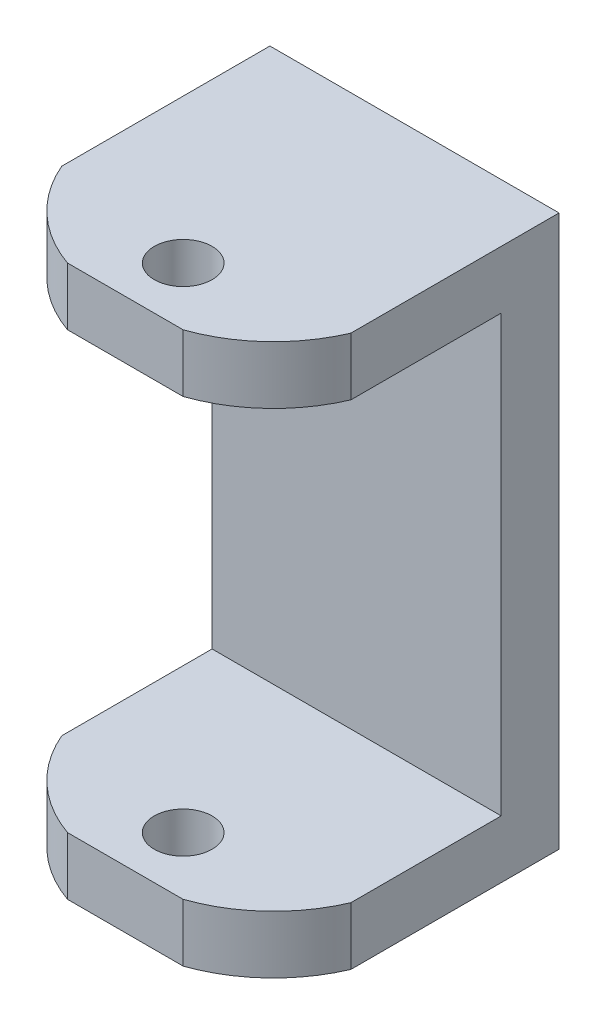
ISO-10303-21;
HEADER;
FILE_DESCRIPTION(('STEP AP214'),'2;1');
FILE_NAME('part.step','',(''),(''),'','','');
FILE_SCHEMA(('AUTOMOTIVE_DESIGN { 1 0 10303 214 1 1 1 1 }'));
ENDSEC;
DATA;
#1=APPLICATION_CONTEXT('core data for automotive mechanical design processes');
#2=APPLICATION_PROTOCOL_DEFINITION('international standard','automotive_design',2000,#1);
#3=PRODUCT_CONTEXT('',#1,'mechanical');
#4=PRODUCT('Part','Part','',(#3));
#5=PRODUCT_RELATED_PRODUCT_CATEGORY('part','',(#4));
#6=PRODUCT_DEFINITION_FORMATION('','',#4);
#7=PRODUCT_DEFINITION_CONTEXT('part definition',#1,'design');
#8=PRODUCT_DEFINITION('design','',#6,#7);
#9=PRODUCT_DEFINITION_SHAPE('','',#8);
#10=(LENGTH_UNIT() NAMED_UNIT(*) SI_UNIT(.MILLI.,.METRE.));
#11=(NAMED_UNIT(*) PLANE_ANGLE_UNIT() SI_UNIT($,.RADIAN.));
#12=(NAMED_UNIT(*) SI_UNIT($,.STERADIAN.) SOLID_ANGLE_UNIT());
#13=UNCERTAINTY_MEASURE_WITH_UNIT(LENGTH_MEASURE(1.E-05),#10,'distance_accuracy_value','');
#14=(GEOMETRIC_REPRESENTATION_CONTEXT(3) GLOBAL_UNCERTAINTY_ASSIGNED_CONTEXT((#13)) GLOBAL_UNIT_ASSIGNED_CONTEXT((#10,
#11,#12)) REPRESENTATION_CONTEXT('',''));
#15=CARTESIAN_POINT('',(0.,0.,0.));
#16=DIRECTION('',(0.,0.,1.));
#17=DIRECTION('',(1.,0.,0.));
#18=AXIS2_PLACEMENT_3D('',#15,#16,#17);
#19=CARTESIAN_POINT('',(-5.00000000000001,47.65,0.));
#20=DIRECTION('',(0.,0.,-1.));
#21=DIRECTION('',(-1.,0.,0.));
#22=AXIS2_PLACEMENT_3D('',#19,#20,#21);
#23=PLANE('',#22);
#24=DIRECTION('',(-1.,0.,0.));
#25=VECTOR('',#24,1.);
#26=CARTESIAN_POINT('',(12.5,42.65,0.));
#27=LINE('',#26,#25);
#28=CARTESIAN_POINT('',(5.00000000000003,42.65,0.));
#29=VERTEX_POINT('',#28);
#30=CARTESIAN_POINT('',(-5.00000000000002,42.65,0.));
#31=VERTEX_POINT('',#30);
#32=EDGE_CURVE('E189',#29,#31,#27,.T.);
#33=ORIENTED_EDGE('',*,*,#32,.F.);
#34=DIRECTION('',(0.,-1.,0.));
#35=VECTOR('',#34,1.);
#36=CARTESIAN_POINT('',(5.,47.65,0.));
#37=LINE('',#36,#35);
#38=CARTESIAN_POINT('',(5.,47.65,0.));
#39=VERTEX_POINT('',#38);
#40=EDGE_CURVE('E139',#39,#29,#37,.T.);
#41=ORIENTED_EDGE('',*,*,#40,.F.);
#42=DIRECTION('',(1.,0.,0.));
#43=VECTOR('',#42,1.);
#44=CARTESIAN_POINT('',(-5.00000000000001,47.65,0.));
#45=LINE('',#44,#43);
#46=CARTESIAN_POINT('',(-5.,47.65,0.));
#47=VERTEX_POINT('',#46);
#48=EDGE_CURVE('E112',#47,#39,#45,.T.);
#49=ORIENTED_EDGE('',*,*,#48,.F.);
#50=DIRECTION('',(0.,-1.,0.));
#51=VECTOR('',#50,1.);
#52=CARTESIAN_POINT('',(-5.,47.65,0.));
#53=LINE('',#52,#51);
#54=EDGE_CURVE('E124',#47,#31,#53,.T.);
#55=ORIENTED_EDGE('',*,*,#54,.T.);
#56=EDGE_LOOP('',(#33,#41,#49,#55));
#57=FACE_BOUND('',#56,.T.);
#58=ADVANCED_FACE('F39',(#57),#23,.F.);
#59=CARTESIAN_POINT('',(-12.5,47.65,-7.));
#60=DIRECTION('',(1.,0.,0.));
#61=DIRECTION('',(0.,0.,-1.));
#62=AXIS2_PLACEMENT_3D('',#59,#60,#61);
#63=PLANE('',#62);
#64=DIRECTION('',(0.,0.,-1.));
#65=VECTOR('',#64,1.);
#66=CARTESIAN_POINT('',(-12.5,42.65,0.));
#67=LINE('',#66,#65);
#68=CARTESIAN_POINT('',(-12.5,42.65,-6.99999999999999));
#69=VERTEX_POINT('',#68);
#70=CARTESIAN_POINT('',(-12.5,42.65,-20.));
#71=VERTEX_POINT('',#70);
#72=EDGE_CURVE('E216',#69,#71,#67,.T.);
#73=ORIENTED_EDGE('',*,*,#72,.F.);
#74=DIRECTION('',(0.,-1.,0.));
#75=VECTOR('',#74,1.);
#76=CARTESIAN_POINT('',(-12.5,47.65,-7.));
#77=LINE('',#76,#75);
#78=CARTESIAN_POINT('',(-12.5,47.65,-7.));
#79=VERTEX_POINT('',#78);
#80=EDGE_CURVE('E165',#79,#69,#77,.T.);
#81=ORIENTED_EDGE('',*,*,#80,.F.);
#82=DIRECTION('',(0.,0.,1.));
#83=VECTOR('',#82,1.);
#84=CARTESIAN_POINT('',(-12.5,47.65,-7.));
#85=LINE('',#84,#83);
#86=CARTESIAN_POINT('',(-12.5,47.65,-25.));
#87=VERTEX_POINT('',#86);
#88=EDGE_CURVE('E118',#87,#79,#85,.T.);
#89=ORIENTED_EDGE('',*,*,#88,.F.);
#90=DIRECTION('',(0.,-1.,0.));
#91=VECTOR('',#90,1.);
#92=CARTESIAN_POINT('',(-12.5,47.65,-25.));
#93=LINE('',#92,#91);
#94=CARTESIAN_POINT('',(-12.5,0.,-25.));
#95=VERTEX_POINT('',#94);
#96=EDGE_CURVE('E48',#87,#95,#93,.T.);
#97=ORIENTED_EDGE('',*,*,#96,.T.);
#98=DIRECTION('',(0.,0.,1.));
#99=VECTOR('',#98,1.);
#100=CARTESIAN_POINT('',(-12.5,0.,-7.));
#101=LINE('',#100,#99);
#102=CARTESIAN_POINT('',(-12.5,0.,-7.));
#103=VERTEX_POINT('',#102);
#104=EDGE_CURVE('E147',#95,#103,#101,.T.);
#105=ORIENTED_EDGE('',*,*,#104,.T.);
#106=CARTESIAN_POINT('',(-12.5,5.00000000000001,-6.99999999999999));
#107=VERTEX_POINT('',#106);
#108=EDGE_CURVE('E135',#107,#103,#77,.T.);
#109=ORIENTED_EDGE('',*,*,#108,.F.);
#110=DIRECTION('',(0.,0.,1.));
#111=VECTOR('',#110,1.);
#112=CARTESIAN_POINT('',(-12.5,5.,0.));
#113=LINE('',#112,#111);
#114=CARTESIAN_POINT('',(-12.5,5.,-20.));
#115=VERTEX_POINT('',#114);
#116=EDGE_CURVE('E185',#115,#107,#113,.T.);
#117=ORIENTED_EDGE('',*,*,#116,.F.);
#118=DIRECTION('',(0.,-1.,0.));
#119=VECTOR('',#118,1.);
#120=CARTESIAN_POINT('',(-12.5,5.,-20.));
#121=LINE('',#120,#119);
#122=EDGE_CURVE('E259',#71,#115,#121,.T.);
#123=ORIENTED_EDGE('',*,*,#122,.F.);
#124=EDGE_LOOP('',(#73,#81,#89,#97,#105,#109,#117,#123));
#125=FACE_BOUND('',#124,.T.);
#126=ADVANCED_FACE('F211',(#125),#63,.F.);
#127=CARTESIAN_POINT('',(-0.81666666666667,47.65,-12.));
#128=DIRECTION('',(0.,-1.,0.));
#129=DIRECTION('',(0.,0.,-1.));
#130=AXIS2_PLACEMENT_3D('',#127,#128,#129);
#131=CYLINDRICAL_SURFACE('',#130,12.7082759561546);
#132=CARTESIAN_POINT('',(-4.99999999999999,5.00000000000001,0.));
#133=VERTEX_POINT('',#132);
#134=CARTESIAN_POINT('',(-5.,0.,0.));
#135=VERTEX_POINT('',#134);
#136=EDGE_CURVE('E134',#133,#135,#53,.T.);
#137=ORIENTED_EDGE('',*,*,#136,.F.);
#138=CARTESIAN_POINT('',(-0.81666666666667,5.,-12.));
#139=DIRECTION('',(0.,-1.,0.));
#140=DIRECTION('',(0.,0.,-1.));
#141=AXIS2_PLACEMENT_3D('',#138,#139,#140);
#142=CIRCLE('',#141,12.7082759561546);
#143=EDGE_CURVE('E200',#133,#107,#142,.T.);
#144=ORIENTED_EDGE('',*,*,#143,.T.);
#145=ORIENTED_EDGE('',*,*,#108,.T.);
#146=CARTESIAN_POINT('',(-0.81666666666667,0.,-12.));
#147=DIRECTION('',(0.,1.,0.));
#148=DIRECTION('',(0.,0.,-1.));
#149=AXIS2_PLACEMENT_3D('',#146,#147,#148);
#150=CIRCLE('',#149,12.7082759561546);
#151=EDGE_CURVE('E146',#103,#135,#150,.T.);
#152=ORIENTED_EDGE('',*,*,#151,.T.);
#153=EDGE_LOOP('',(#137,#144,#145,#152));
#154=FACE_BOUND('',#153,.T.);
#155=ADVANCED_FACE('F241',(#154),#131,.T.);
#156=CARTESIAN_POINT('',(0.81666666666667,47.65,-12.));
#157=DIRECTION('',(0.,-1.,0.));
#158=DIRECTION('',(0.,0.,-1.));
#159=AXIS2_PLACEMENT_3D('',#156,#157,#158);
#160=CYLINDRICAL_SURFACE('',#159,12.7082759561546);
#161=DIRECTION('',(0.,-1.,0.));
#162=VECTOR('',#161,1.);
#163=CARTESIAN_POINT('',(12.5,47.65,-6.99999999999998));
#164=LINE('',#163,#162);
#165=CARTESIAN_POINT('',(12.5,5.00000000000001,-6.99999999999998));
#166=VERTEX_POINT('',#165);
#167=CARTESIAN_POINT('',(12.5,0.,-6.99999999999998));
#168=VERTEX_POINT('',#167);
#169=EDGE_CURVE('E93',#166,#168,#164,.T.);
#170=ORIENTED_EDGE('',*,*,#169,.F.);
#171=CARTESIAN_POINT('',(0.81666666666667,5.,-12.));
#172=DIRECTION('',(0.,-1.,0.));
#173=DIRECTION('',(0.,0.,-1.));
#174=AXIS2_PLACEMENT_3D('',#171,#172,#173);
#175=CIRCLE('',#174,12.7082759561546);
#176=CARTESIAN_POINT('',(5.00000000000001,5.00000000000001,0.));
#177=VERTEX_POINT('',#176);
#178=EDGE_CURVE('E192',#166,#177,#175,.T.);
#179=ORIENTED_EDGE('',*,*,#178,.T.);
#180=CARTESIAN_POINT('',(5.,0.,0.));
#181=VERTEX_POINT('',#180);
#182=EDGE_CURVE('E164',#177,#181,#37,.T.);
#183=ORIENTED_EDGE('',*,*,#182,.T.);
#184=CARTESIAN_POINT('',(0.81666666666667,0.,-12.));
#185=DIRECTION('',(0.,1.,0.));
#186=DIRECTION('',(0.,0.,1.));
#187=AXIS2_PLACEMENT_3D('',#184,#185,#186);
#188=CIRCLE('',#187,12.7082759561546);
#189=EDGE_CURVE('E155',#181,#168,#188,.T.);
#190=ORIENTED_EDGE('',*,*,#189,.T.);
#191=EDGE_LOOP('',(#170,#179,#183,#190));
#192=FACE_BOUND('',#191,.T.);
#193=ADVANCED_FACE('F251',(#192),#160,.T.);
#194=CARTESIAN_POINT('',(0.,47.65,-5.));
#195=DIRECTION('',(0.,-1.,0.));
#196=DIRECTION('',(0.,0.,-1.));
#197=AXIS2_PLACEMENT_3D('',#194,#195,#196);
#198=CYLINDRICAL_SURFACE('',#197,2.5);
#199=CARTESIAN_POINT('',(0.,5.,-5.));
#200=DIRECTION('',(0.,-1.,0.));
#201=DIRECTION('',(0.,0.,-1.));
#202=AXIS2_PLACEMENT_3D('',#199,#200,#201);
#203=CIRCLE('',#202,2.5);
#204=CARTESIAN_POINT('',(0.,5.,-7.5));
#205=VERTEX_POINT('',#204);
#206=EDGE_CURVE('E43',#205,#205,#203,.T.);
#207=ORIENTED_EDGE('',*,*,#206,.F.);
#208=EDGE_LOOP('',(#207));
#209=FACE_BOUND('',#208,.T.);
#210=CARTESIAN_POINT('',(0.,0.,-5.));
#211=DIRECTION('',(0.,1.,0.));
#212=DIRECTION('',(0.,0.,1.));
#213=AXIS2_PLACEMENT_3D('',#210,#211,#212);
#214=CIRCLE('',#213,2.5);
#215=CARTESIAN_POINT('',(0.,0.,-2.5));
#216=VERTEX_POINT('',#215);
#217=EDGE_CURVE('E199',#216,#216,#214,.T.);
#218=ORIENTED_EDGE('',*,*,#217,.F.);
#219=EDGE_LOOP('',(#218));
#220=FACE_BOUND('',#219,.T.);
#221=ADVANCED_FACE('F299',(#209,#220),#198,.F.);
#222=CARTESIAN_POINT('',(-0.81666666666667,47.65,-12.));
#223=DIRECTION('',(0.,-1.,0.));
#224=DIRECTION('',(0.,0.,-1.));
#225=AXIS2_PLACEMENT_3D('',#222,#223,#224);
#226=PLANE('',#225);
#227=DIRECTION('',(0.,0.,-1.));
#228=VECTOR('',#227,1.);
#229=CARTESIAN_POINT('',(12.5,47.65,-6.99999999999998));
#230=LINE('',#229,#228);
#231=CARTESIAN_POINT('',(12.5,47.65,-6.99999999999998));
#232=VERTEX_POINT('',#231);
#233=CARTESIAN_POINT('',(12.5,47.65,-25.));
#234=VERTEX_POINT('',#233);
#235=EDGE_CURVE('E160',#232,#234,#230,.T.);
#236=ORIENTED_EDGE('',*,*,#235,.T.);
#237=DIRECTION('',(-1.,0.,0.));
#238=VECTOR('',#237,1.);
#239=CARTESIAN_POINT('',(-12.5,47.65,-25.));
#240=LINE('',#239,#238);
#241=EDGE_CURVE('E101',#234,#87,#240,.T.);
#242=ORIENTED_EDGE('',*,*,#241,.T.);
#243=ORIENTED_EDGE('',*,*,#88,.T.);
#244=CARTESIAN_POINT('',(-0.81666666666667,47.65,-12.));
#245=DIRECTION('',(0.,1.,0.));
#246=DIRECTION('',(0.,0.,-1.));
#247=AXIS2_PLACEMENT_3D('',#244,#245,#246);
#248=CIRCLE('',#247,12.7082759561546);
#249=EDGE_CURVE('E109',#79,#47,#248,.T.);
#250=ORIENTED_EDGE('',*,*,#249,.T.);
#251=ORIENTED_EDGE('',*,*,#48,.T.);
#252=CARTESIAN_POINT('',(0.81666666666667,47.65,-12.));
#253=DIRECTION('',(0.,1.,0.));
#254=DIRECTION('',(0.,0.,1.));
#255=AXIS2_PLACEMENT_3D('',#252,#253,#254);
#256=CIRCLE('',#255,12.7082759561546);
#257=EDGE_CURVE('E62',#39,#232,#256,.T.);
#258=ORIENTED_EDGE('',*,*,#257,.T.);
#259=EDGE_LOOP('',(#236,#242,#243,#250,#251,#258));
#260=FACE_BOUND('',#259,.T.);
#261=CARTESIAN_POINT('',(0.,47.65,-5.));
#262=DIRECTION('',(0.,1.,0.));
#263=DIRECTION('',(0.,0.,1.));
#264=AXIS2_PLACEMENT_3D('',#261,#262,#263);
#265=CIRCLE('',#264,2.5);
#266=CARTESIAN_POINT('',(0.,47.65,-2.5));
#267=VERTEX_POINT('',#266);
#268=EDGE_CURVE('E142',#267,#267,#265,.T.);
#269=ORIENTED_EDGE('',*,*,#268,.F.);
#270=EDGE_LOOP('',(#269));
#271=FACE_BOUND('',#270,.T.);
#272=ADVANCED_FACE('F115',(#260,#271),#226,.F.);
#273=CARTESIAN_POINT('',(-0.81666666666667,0.,-12.));
#274=DIRECTION('',(0.,-1.,0.));
#275=DIRECTION('',(0.,0.,-1.));
#276=AXIS2_PLACEMENT_3D('',#273,#274,#275);
#277=PLANE('',#276);
#278=DIRECTION('',(0.,0.,-1.));
#279=VECTOR('',#278,1.);
#280=CARTESIAN_POINT('',(12.5,0.,-6.99999999999998));
#281=LINE('',#280,#279);
#282=CARTESIAN_POINT('',(12.5,0.,-25.));
#283=VERTEX_POINT('',#282);
#284=EDGE_CURVE('E141',#168,#283,#281,.T.);
#285=ORIENTED_EDGE('',*,*,#284,.F.);
#286=ORIENTED_EDGE('',*,*,#189,.F.);
#287=DIRECTION('',(1.,0.,0.));
#288=VECTOR('',#287,1.);
#289=CARTESIAN_POINT('',(-5.00000000000001,0.,0.));
#290=LINE('',#289,#288);
#291=EDGE_CURVE('E152',#135,#181,#290,.T.);
#292=ORIENTED_EDGE('',*,*,#291,.F.);
#293=ORIENTED_EDGE('',*,*,#151,.F.);
#294=ORIENTED_EDGE('',*,*,#104,.F.);
#295=DIRECTION('',(-1.,0.,0.));
#296=VECTOR('',#295,1.);
#297=CARTESIAN_POINT('',(-12.5,0.,-25.));
#298=LINE('',#297,#296);
#299=EDGE_CURVE('E143',#283,#95,#298,.T.);
#300=ORIENTED_EDGE('',*,*,#299,.F.);
#301=EDGE_LOOP('',(#285,#286,#292,#293,#294,#300));
#302=FACE_BOUND('',#301,.T.);
#303=ORIENTED_EDGE('',*,*,#217,.T.);
#304=EDGE_LOOP('',(#303));
#305=FACE_BOUND('',#304,.T.);
#306=ADVANCED_FACE('F247',(#302,#305),#277,.T.);
#307=CARTESIAN_POINT('',(12.5,47.65,-6.99999999999998));
#308=DIRECTION('',(-1.,0.,0.));
#309=DIRECTION('',(0.,0.,1.));
#310=AXIS2_PLACEMENT_3D('',#307,#308,#309);
#311=PLANE('',#310);
#312=DIRECTION('',(0.,-1.,0.));
#313=VECTOR('',#312,1.);
#314=CARTESIAN_POINT('',(12.5,5.,-20.));
#315=LINE('',#314,#313);
#316=CARTESIAN_POINT('',(12.5,42.65,-20.));
#317=VERTEX_POINT('',#316);
#318=CARTESIAN_POINT('',(12.5,5.,-20.));
#319=VERTEX_POINT('',#318);
#320=EDGE_CURVE('E255',#317,#319,#315,.T.);
#321=ORIENTED_EDGE('',*,*,#320,.T.);
#322=DIRECTION('',(0.,0.,1.));
#323=VECTOR('',#322,1.);
#324=CARTESIAN_POINT('',(12.5,5.,0.));
#325=LINE('',#324,#323);
#326=EDGE_CURVE('E191',#319,#166,#325,.T.);
#327=ORIENTED_EDGE('',*,*,#326,.T.);
#328=ORIENTED_EDGE('',*,*,#169,.T.);
#329=ORIENTED_EDGE('',*,*,#284,.T.);
#330=DIRECTION('',(0.,-1.,0.));
#331=VECTOR('',#330,1.);
#332=CARTESIAN_POINT('',(12.5,47.65,-25.));
#333=LINE('',#332,#331);
#334=EDGE_CURVE('E11',#234,#283,#333,.T.);
#335=ORIENTED_EDGE('',*,*,#334,.F.);
#336=ORIENTED_EDGE('',*,*,#235,.F.);
#337=CARTESIAN_POINT('',(12.5,42.65,-6.99999999999998));
#338=VERTEX_POINT('',#337);
#339=EDGE_CURVE('E156',#232,#338,#164,.T.);
#340=ORIENTED_EDGE('',*,*,#339,.T.);
#341=DIRECTION('',(0.,0.,-1.));
#342=VECTOR('',#341,1.);
#343=CARTESIAN_POINT('',(12.5,42.65,0.));
#344=LINE('',#343,#342);
#345=EDGE_CURVE('E57',#338,#317,#344,.T.);
#346=ORIENTED_EDGE('',*,*,#345,.T.);
#347=EDGE_LOOP('',(#321,#327,#328,#329,#335,#336,#340,#346));
#348=FACE_BOUND('',#347,.T.);
#349=ADVANCED_FACE('F41',(#348),#311,.F.);
#350=CARTESIAN_POINT('',(-12.5,47.65,-25.));
#351=DIRECTION('',(0.,0.,1.));
#352=DIRECTION('',(1.,0.,0.));
#353=AXIS2_PLACEMENT_3D('',#350,#351,#352);
#354=PLANE('',#353);
#355=ORIENTED_EDGE('',*,*,#299,.T.);
#356=ORIENTED_EDGE('',*,*,#96,.F.);
#357=ORIENTED_EDGE('',*,*,#241,.F.);
#358=ORIENTED_EDGE('',*,*,#334,.T.);
#359=EDGE_LOOP('',(#355,#356,#357,#358));
#360=FACE_BOUND('',#359,.T.);
#361=ADVANCED_FACE('F209',(#360),#354,.F.);
#362=ORIENTED_EDGE('',*,*,#80,.T.);
#363=CARTESIAN_POINT('',(-0.81666666666667,42.65,-12.));
#364=DIRECTION('',(0.,1.,0.));
#365=DIRECTION('',(0.,0.,1.));
#366=AXIS2_PLACEMENT_3D('',#363,#364,#365);
#367=CIRCLE('',#366,12.7082759561546);
#368=EDGE_CURVE('E128',#69,#31,#367,.T.);
#369=ORIENTED_EDGE('',*,*,#368,.T.);
#370=ORIENTED_EDGE('',*,*,#54,.F.);
#371=ORIENTED_EDGE('',*,*,#249,.F.);
#372=EDGE_LOOP('',(#362,#369,#370,#371));
#373=FACE_BOUND('',#372,.T.);
#374=ADVANCED_FACE('F126',(#373),#131,.T.);
#375=ORIENTED_EDGE('',*,*,#182,.F.);
#376=DIRECTION('',(-1.,0.,0.));
#377=VECTOR('',#376,1.);
#378=CARTESIAN_POINT('',(12.5,5.,0.));
#379=LINE('',#378,#377);
#380=EDGE_CURVE('E167',#177,#133,#379,.T.);
#381=ORIENTED_EDGE('',*,*,#380,.T.);
#382=ORIENTED_EDGE('',*,*,#136,.T.);
#383=ORIENTED_EDGE('',*,*,#291,.T.);
#384=EDGE_LOOP('',(#375,#381,#382,#383));
#385=FACE_BOUND('',#384,.T.);
#386=ADVANCED_FACE('F246',(#385),#23,.F.);
#387=ORIENTED_EDGE('',*,*,#40,.T.);
#388=CARTESIAN_POINT('',(0.81666666666667,42.65,-12.));
#389=DIRECTION('',(0.,1.,0.));
#390=DIRECTION('',(0.,0.,1.));
#391=AXIS2_PLACEMENT_3D('',#388,#389,#390);
#392=CIRCLE('',#391,12.7082759561546);
#393=EDGE_CURVE('E168',#29,#338,#392,.T.);
#394=ORIENTED_EDGE('',*,*,#393,.T.);
#395=ORIENTED_EDGE('',*,*,#339,.F.);
#396=ORIENTED_EDGE('',*,*,#257,.F.);
#397=EDGE_LOOP('',(#387,#394,#395,#396));
#398=FACE_BOUND('',#397,.T.);
#399=ADVANCED_FACE('F281',(#398),#160,.T.);
#400=CARTESIAN_POINT('',(0.,42.65,-5.));
#401=DIRECTION('',(0.,1.,0.));
#402=DIRECTION('',(0.,0.,1.));
#403=AXIS2_PLACEMENT_3D('',#400,#401,#402);
#404=CIRCLE('',#403,2.5);
#405=CARTESIAN_POINT('',(0.,42.65,-2.5));
#406=VERTEX_POINT('',#405);
#407=EDGE_CURVE('E166',#406,#406,#404,.T.);
#408=ORIENTED_EDGE('',*,*,#407,.F.);
#409=EDGE_LOOP('',(#408));
#410=FACE_BOUND('',#409,.T.);
#411=ORIENTED_EDGE('',*,*,#268,.T.);
#412=EDGE_LOOP('',(#411));
#413=FACE_BOUND('',#412,.T.);
#414=ADVANCED_FACE('F288',(#410,#413),#198,.F.);
#415=CARTESIAN_POINT('',(12.5,5.,0.));
#416=DIRECTION('',(0.,-1.,0.));
#417=DIRECTION('',(0.,0.,-1.));
#418=AXIS2_PLACEMENT_3D('',#415,#416,#417);
#419=PLANE('',#418);
#420=ORIENTED_EDGE('',*,*,#206,.T.);
#421=EDGE_LOOP('',(#420));
#422=FACE_BOUND('',#421,.T.);
#423=ORIENTED_EDGE('',*,*,#380,.F.);
#424=ORIENTED_EDGE('',*,*,#178,.F.);
#425=ORIENTED_EDGE('',*,*,#326,.F.);
#426=DIRECTION('',(-1.,0.,0.));
#427=VECTOR('',#426,1.);
#428=CARTESIAN_POINT('',(12.5,5.,-20.));
#429=LINE('',#428,#427);
#430=EDGE_CURVE('E171',#319,#115,#429,.T.);
#431=ORIENTED_EDGE('',*,*,#430,.T.);
#432=ORIENTED_EDGE('',*,*,#116,.T.);
#433=ORIENTED_EDGE('',*,*,#143,.F.);
#434=EDGE_LOOP('',(#423,#424,#425,#431,#432,#433));
#435=FACE_BOUND('',#434,.T.);
#436=ADVANCED_FACE('F236',(#422,#435),#419,.F.);
#437=CARTESIAN_POINT('',(12.5,42.65,0.));
#438=DIRECTION('',(0.,1.,0.));
#439=DIRECTION('',(0.,0.,1.));
#440=AXIS2_PLACEMENT_3D('',#437,#438,#439);
#441=PLANE('',#440);
#442=ORIENTED_EDGE('',*,*,#407,.T.);
#443=EDGE_LOOP('',(#442));
#444=FACE_BOUND('',#443,.T.);
#445=ORIENTED_EDGE('',*,*,#72,.T.);
#446=DIRECTION('',(-1.,0.,0.));
#447=VECTOR('',#446,1.);
#448=CARTESIAN_POINT('',(12.5,42.65,-20.));
#449=LINE('',#448,#447);
#450=EDGE_CURVE('E183',#317,#71,#449,.T.);
#451=ORIENTED_EDGE('',*,*,#450,.F.);
#452=ORIENTED_EDGE('',*,*,#345,.F.);
#453=ORIENTED_EDGE('',*,*,#393,.F.);
#454=ORIENTED_EDGE('',*,*,#32,.T.);
#455=ORIENTED_EDGE('',*,*,#368,.F.);
#456=EDGE_LOOP('',(#445,#451,#452,#453,#454,#455));
#457=FACE_BOUND('',#456,.T.);
#458=ADVANCED_FACE('F262',(#444,#457),#441,.F.);
#459=CARTESIAN_POINT('',(12.5,5.,-20.));
#460=DIRECTION('',(0.,0.,-1.));
#461=DIRECTION('',(0.,1.,0.));
#462=AXIS2_PLACEMENT_3D('',#459,#460,#461);
#463=PLANE('',#462);
#464=ORIENTED_EDGE('',*,*,#122,.T.);
#465=ORIENTED_EDGE('',*,*,#430,.F.);
#466=ORIENTED_EDGE('',*,*,#320,.F.);
#467=ORIENTED_EDGE('',*,*,#450,.T.);
#468=EDGE_LOOP('',(#464,#465,#466,#467));
#469=FACE_BOUND('',#468,.T.);
#470=ADVANCED_FACE('F266',(#469),#463,.F.);
#471=CLOSED_SHELL('',(#58,#126,#155,#193,#221,#272,#306,#349,#361,#374,#386,#399,#414,#436,#458,#470));
#472=MANIFOLD_SOLID_BREP('B2',#471);
#473=ADVANCED_BREP_SHAPE_REPRESENTATION('',(#18,#472),#14);
#474=SHAPE_DEFINITION_REPRESENTATION(#9,#473);
ENDSEC;
END-ISO-10303-21;
